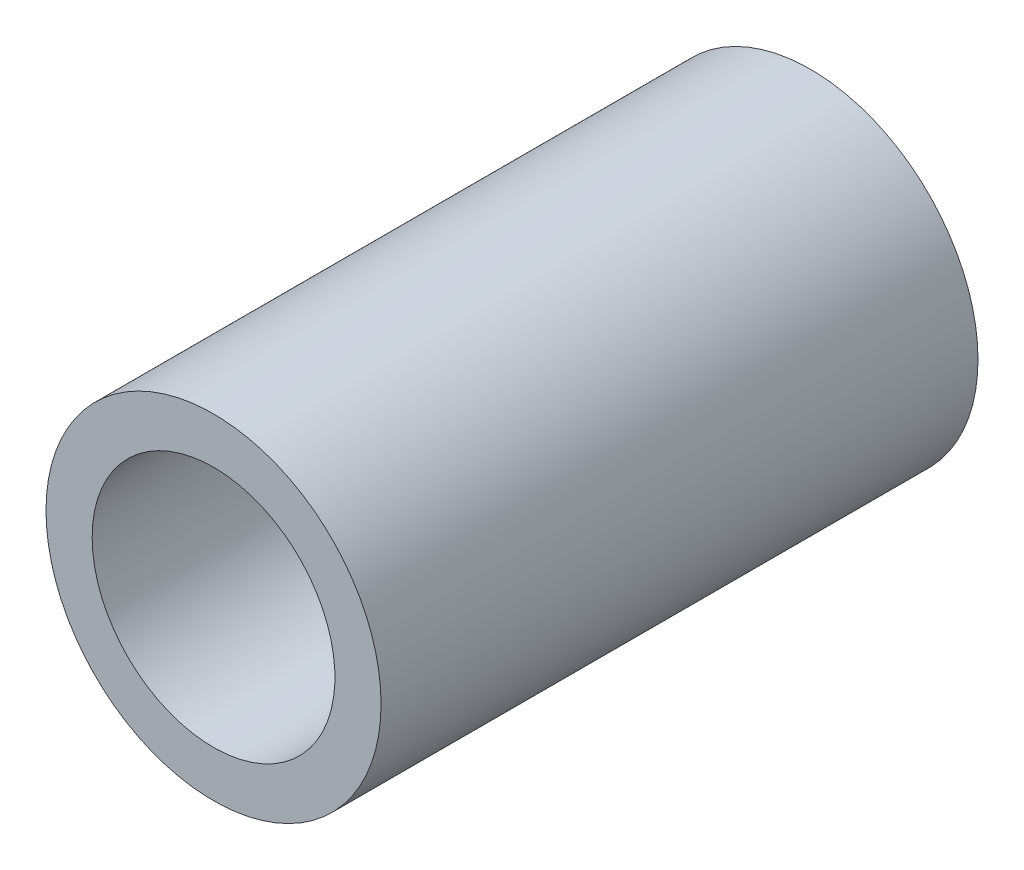
ISO-10303-21;
HEADER;
FILE_DESCRIPTION(('STEP AP214'),'2;1');
FILE_NAME('part.step','',(''),(''),'','','');
FILE_SCHEMA(('AUTOMOTIVE_DESIGN { 1 0 10303 214 1 1 1 1 }'));
ENDSEC;
DATA;
#1=APPLICATION_CONTEXT('core data for automotive mechanical design processes');
#2=APPLICATION_PROTOCOL_DEFINITION('international standard','automotive_design',2000,#1);
#3=PRODUCT_CONTEXT('',#1,'mechanical');
#4=PRODUCT('Part','Part','',(#3));
#5=PRODUCT_RELATED_PRODUCT_CATEGORY('part','',(#4));
#6=PRODUCT_DEFINITION_FORMATION('','',#4);
#7=PRODUCT_DEFINITION_CONTEXT('part definition',#1,'design');
#8=PRODUCT_DEFINITION('design','',#6,#7);
#9=PRODUCT_DEFINITION_SHAPE('','',#8);
#10=(LENGTH_UNIT() NAMED_UNIT(*) SI_UNIT(.MILLI.,.METRE.));
#11=(NAMED_UNIT(*) PLANE_ANGLE_UNIT() SI_UNIT($,.RADIAN.));
#12=(NAMED_UNIT(*) SI_UNIT($,.STERADIAN.) SOLID_ANGLE_UNIT());
#13=UNCERTAINTY_MEASURE_WITH_UNIT(LENGTH_MEASURE(1.E-05),#10,'distance_accuracy_value','');
#14=(GEOMETRIC_REPRESENTATION_CONTEXT(3) GLOBAL_UNCERTAINTY_ASSIGNED_CONTEXT((#13)) GLOBAL_UNIT_ASSIGNED_CONTEXT((#10,
#11,#12)) REPRESENTATION_CONTEXT('',''));
#15=CARTESIAN_POINT('',(0.,0.,0.));
#16=DIRECTION('',(0.,0.,1.));
#17=DIRECTION('',(1.,0.,0.));
#18=AXIS2_PLACEMENT_3D('',#15,#16,#17);
#19=CARTESIAN_POINT('',(0.,0.,38.1));
#20=DIRECTION('',(0.,0.,1.));
#21=DIRECTION('',(1.,0.,0.));
#22=AXIS2_PLACEMENT_3D('',#19,#20,#21);
#23=PLANE('',#22);
#24=CARTESIAN_POINT('',(0.,0.,38.1));
#25=DIRECTION('',(0.,0.,1.));
#26=DIRECTION('',(1.,0.,0.));
#27=AXIS2_PLACEMENT_3D('',#24,#25,#26);
#28=CIRCLE('',#27,10.6934);
#29=CARTESIAN_POINT('',(-10.6934,0.,38.1));
#30=VERTEX_POINT('',#29);
#31=EDGE_CURVE('E10',#30,#30,#28,.T.);
#32=ORIENTED_EDGE('',*,*,#31,.T.);
#33=EDGE_LOOP('',(#32));
#34=FACE_BOUND('',#33,.T.);
#35=CARTESIAN_POINT('',(0.,0.,38.1));
#36=DIRECTION('',(0.,0.,1.));
#37=DIRECTION('',(1.,0.,0.));
#38=AXIS2_PLACEMENT_3D('',#35,#36,#37);
#39=CIRCLE('',#38,7.747);
#40=CARTESIAN_POINT('',(-7.747,0.,38.1));
#41=VERTEX_POINT('',#40);
#42=EDGE_CURVE('E46',#41,#41,#39,.T.);
#43=ORIENTED_EDGE('',*,*,#42,.F.);
#44=EDGE_LOOP('',(#43));
#45=FACE_BOUND('',#44,.T.);
#46=ADVANCED_FACE('F35',(#34,#45),#23,.T.);
#47=CARTESIAN_POINT('',(0.,0.,0.));
#48=DIRECTION('',(0.,0.,1.));
#49=DIRECTION('',(1.,0.,0.));
#50=AXIS2_PLACEMENT_3D('',#47,#48,#49);
#51=PLANE('',#50);
#52=CARTESIAN_POINT('',(0.,0.,0.));
#53=DIRECTION('',(0.,0.,1.));
#54=DIRECTION('',(1.,0.,0.));
#55=AXIS2_PLACEMENT_3D('',#52,#53,#54);
#56=CIRCLE('',#55,10.6934);
#57=CARTESIAN_POINT('',(-10.6934,0.,0.));
#58=VERTEX_POINT('',#57);
#59=EDGE_CURVE('E39',#58,#58,#56,.T.);
#60=ORIENTED_EDGE('',*,*,#59,.F.);
#61=EDGE_LOOP('',(#60));
#62=FACE_BOUND('',#61,.T.);
#63=CARTESIAN_POINT('',(0.,0.,0.));
#64=DIRECTION('',(0.,0.,1.));
#65=DIRECTION('',(1.,0.,0.));
#66=AXIS2_PLACEMENT_3D('',#63,#64,#65);
#67=CIRCLE('',#66,7.747);
#68=CARTESIAN_POINT('',(-7.747,0.,0.));
#69=VERTEX_POINT('',#68);
#70=EDGE_CURVE('E48',#69,#69,#67,.T.);
#71=ORIENTED_EDGE('',*,*,#70,.T.);
#72=EDGE_LOOP('',(#71));
#73=FACE_BOUND('',#72,.T.);
#74=ADVANCED_FACE('F58',(#62,#73),#51,.F.);
#75=CARTESIAN_POINT('',(0.,0.,38.1));
#76=DIRECTION('',(0.,0.,-1.));
#77=DIRECTION('',(-1.,0.,0.));
#78=AXIS2_PLACEMENT_3D('',#75,#76,#77);
#79=CYLINDRICAL_SURFACE('',#78,10.6934);
#80=CARTESIAN_POINT('',(-10.6934,0.,38.1));
#81=CARTESIAN_POINT('',(-10.6934,0.,37.703125));
#82=CARTESIAN_POINT('',(-10.6934,0.,37.30625));
#83=CARTESIAN_POINT('',(-10.6934,0.,36.5125));
#84=CARTESIAN_POINT('',(-10.6934,0.,36.115625));
#85=CARTESIAN_POINT('',(-10.6934,0.,35.321875));
#86=CARTESIAN_POINT('',(-10.6934,0.,34.925));
#87=CARTESIAN_POINT('',(-10.6934,0.,34.13125));
#88=CARTESIAN_POINT('',(-10.6934,0.,33.734375));
#89=CARTESIAN_POINT('',(-10.6934,0.,32.940625));
#90=CARTESIAN_POINT('',(-10.6934,0.,32.54375));
#91=CARTESIAN_POINT('',(-10.6934,0.,31.75));
#92=CARTESIAN_POINT('',(-10.6934,0.,31.353125));
#93=CARTESIAN_POINT('',(-10.6934,0.,30.559375));
#94=CARTESIAN_POINT('',(-10.6934,0.,30.1625));
#95=CARTESIAN_POINT('',(-10.6934,0.,29.36875));
#96=CARTESIAN_POINT('',(-10.6934,0.,28.971875));
#97=CARTESIAN_POINT('',(-10.6934,0.,28.178125));
#98=CARTESIAN_POINT('',(-10.6934,0.,27.78125));
#99=CARTESIAN_POINT('',(-10.6934,0.,26.9875));
#100=CARTESIAN_POINT('',(-10.6934,0.,26.590625));
#101=CARTESIAN_POINT('',(-10.6934,0.,25.796875));
#102=CARTESIAN_POINT('',(-10.6934,0.,25.4));
#103=CARTESIAN_POINT('',(-10.6934,0.,24.60625));
#104=CARTESIAN_POINT('',(-10.6934,0.,24.209375));
#105=CARTESIAN_POINT('',(-10.6934,0.,23.415625));
#106=CARTESIAN_POINT('',(-10.6934,0.,23.01875));
#107=CARTESIAN_POINT('',(-10.6934,0.,22.225));
#108=CARTESIAN_POINT('',(-10.6934,0.,21.828125));
#109=CARTESIAN_POINT('',(-10.6934,0.,21.034375));
#110=CARTESIAN_POINT('',(-10.6934,0.,20.6375));
#111=CARTESIAN_POINT('',(-10.6934,0.,19.84375));
#112=CARTESIAN_POINT('',(-10.6934,0.,19.446875));
#113=CARTESIAN_POINT('',(-10.6934,0.,18.653125));
#114=CARTESIAN_POINT('',(-10.6934,0.,18.25625));
#115=CARTESIAN_POINT('',(-10.6934,0.,17.4625));
#116=CARTESIAN_POINT('',(-10.6934,0.,17.065625));
#117=CARTESIAN_POINT('',(-10.6934,0.,16.271875));
#118=CARTESIAN_POINT('',(-10.6934,0.,15.875));
#119=CARTESIAN_POINT('',(-10.6934,0.,15.08125));
#120=CARTESIAN_POINT('',(-10.6934,0.,14.684375));
#121=CARTESIAN_POINT('',(-10.6934,0.,13.890625));
#122=CARTESIAN_POINT('',(-10.6934,0.,13.49375));
#123=CARTESIAN_POINT('',(-10.6934,0.,12.7));
#124=CARTESIAN_POINT('',(-10.6934,0.,12.303125));
#125=CARTESIAN_POINT('',(-10.6934,0.,11.509375));
#126=CARTESIAN_POINT('',(-10.6934,0.,11.1125));
#127=CARTESIAN_POINT('',(-10.6934,0.,10.31875));
#128=CARTESIAN_POINT('',(-10.6934,0.,9.92187499999999));
#129=CARTESIAN_POINT('',(-10.6934,0.,9.128125));
#130=CARTESIAN_POINT('',(-10.6934,0.,8.73124999999999));
#131=CARTESIAN_POINT('',(-10.6934,0.,7.93749999999999));
#132=CARTESIAN_POINT('',(-10.6934,0.,7.54062499999999));
#133=CARTESIAN_POINT('',(-10.6934,0.,6.746875));
#134=CARTESIAN_POINT('',(-10.6934,0.,6.35));
#135=CARTESIAN_POINT('',(-10.6934,0.,5.55625));
#136=CARTESIAN_POINT('',(-10.6934,0.,5.159375));
#137=CARTESIAN_POINT('',(-10.6934,0.,4.365625));
#138=CARTESIAN_POINT('',(-10.6934,0.,3.96875));
#139=CARTESIAN_POINT('',(-10.6934,0.,3.175));
#140=CARTESIAN_POINT('',(-10.6934,0.,2.778125));
#141=CARTESIAN_POINT('',(-10.6934,0.,1.984375));
#142=CARTESIAN_POINT('',(-10.6934,0.,1.5875));
#143=CARTESIAN_POINT('',(-10.6934,0.,0.79375));
#144=CARTESIAN_POINT('',(-10.6934,0.,0.396875));
#145=CARTESIAN_POINT('',(-10.6934,0.,0.));
#146=B_SPLINE_CURVE_WITH_KNOTS('',3,(#80,#81,#82,#83,#84,#85,#86,#87,#88,#89,#90,#91,#92,#93,
#94,#95,#96,#97,#98,#99,#100,#101,#102,#103,#104,#105,#106,#107,#108,#109,#110,#111,#112,#113,
#114,#115,#116,#117,#118,#119,#120,#121,#122,#123,#124,#125,#126,#127,#128,#129,#130,#131,#132,
#133,#134,#135,#136,#137,#138,#139,#140,#141,#142,#143,#144,#145),.UNSPECIFIED.,.F.,.F.,(4,2,2,
2,2,2,2,2,2,2,2,2,2,2,2,2,2,2,2,2,2,2,2,2,2,2,2,2,2,2,2,2,4),(0.,1.190625,2.38125,3.571875,
4.7625,5.953125,7.14375,8.334375,9.52500000000001,10.715625,11.90625,13.096875,14.2875,
15.478125,16.66875,17.859375,19.05,20.240625,21.43125,22.621875,23.8125,25.003125,26.19375,
27.384375,28.575,29.765625,30.95625,32.146875,33.3375,34.528125,35.71875,36.909375,38.1),.UNSPECIFIED.);
#147=EDGE_CURVE('BSEAM37',#30,#58,#146,.T.);
#148=ORIENTED_EDGE('',*,*,#31,.F.);
#149=ORIENTED_EDGE('',*,*,#59,.T.);
#150=ORIENTED_EDGE('',*,*,#147,.T.);
#151=ORIENTED_EDGE('',*,*,#147,.F.);
#152=EDGE_LOOP('',(#148,#150,#149,#151));
#153=FACE_BOUND('',#152,.T.);
#154=ADVANCED_FACE('F37',(#153),#79,.T.);
#155=CARTESIAN_POINT('',(0.,0.,38.1));
#156=DIRECTION('',(0.,0.,-1.));
#157=DIRECTION('',(-1.,0.,0.));
#158=AXIS2_PLACEMENT_3D('',#155,#156,#157);
#159=CYLINDRICAL_SURFACE('',#158,7.747);
#160=CARTESIAN_POINT('',(-7.747,0.,38.1));
#161=CARTESIAN_POINT('',(-7.747,0.,37.703125));
#162=CARTESIAN_POINT('',(-7.747,0.,37.30625));
#163=CARTESIAN_POINT('',(-7.747,0.,36.5125));
#164=CARTESIAN_POINT('',(-7.747,0.,36.115625));
#165=CARTESIAN_POINT('',(-7.747,0.,35.321875));
#166=CARTESIAN_POINT('',(-7.747,0.,34.925));
#167=CARTESIAN_POINT('',(-7.747,0.,34.13125));
#168=CARTESIAN_POINT('',(-7.747,0.,33.734375));
#169=CARTESIAN_POINT('',(-7.747,0.,32.940625));
#170=CARTESIAN_POINT('',(-7.747,0.,32.54375));
#171=CARTESIAN_POINT('',(-7.747,0.,31.75));
#172=CARTESIAN_POINT('',(-7.747,0.,31.353125));
#173=CARTESIAN_POINT('',(-7.747,0.,30.559375));
#174=CARTESIAN_POINT('',(-7.747,0.,30.1625));
#175=CARTESIAN_POINT('',(-7.747,0.,29.36875));
#176=CARTESIAN_POINT('',(-7.747,0.,28.971875));
#177=CARTESIAN_POINT('',(-7.747,0.,28.178125));
#178=CARTESIAN_POINT('',(-7.747,0.,27.78125));
#179=CARTESIAN_POINT('',(-7.747,0.,26.9875));
#180=CARTESIAN_POINT('',(-7.747,0.,26.590625));
#181=CARTESIAN_POINT('',(-7.747,0.,25.796875));
#182=CARTESIAN_POINT('',(-7.747,0.,25.4));
#183=CARTESIAN_POINT('',(-7.747,0.,24.60625));
#184=CARTESIAN_POINT('',(-7.747,0.,24.209375));
#185=CARTESIAN_POINT('',(-7.747,0.,23.415625));
#186=CARTESIAN_POINT('',(-7.747,0.,23.01875));
#187=CARTESIAN_POINT('',(-7.747,0.,22.225));
#188=CARTESIAN_POINT('',(-7.747,0.,21.828125));
#189=CARTESIAN_POINT('',(-7.747,0.,21.034375));
#190=CARTESIAN_POINT('',(-7.747,0.,20.6375));
#191=CARTESIAN_POINT('',(-7.747,0.,19.84375));
#192=CARTESIAN_POINT('',(-7.747,0.,19.446875));
#193=CARTESIAN_POINT('',(-7.747,0.,18.653125));
#194=CARTESIAN_POINT('',(-7.747,0.,18.25625));
#195=CARTESIAN_POINT('',(-7.747,0.,17.4625));
#196=CARTESIAN_POINT('',(-7.747,0.,17.065625));
#197=CARTESIAN_POINT('',(-7.747,0.,16.271875));
#198=CARTESIAN_POINT('',(-7.747,0.,15.875));
#199=CARTESIAN_POINT('',(-7.747,0.,15.08125));
#200=CARTESIAN_POINT('',(-7.747,0.,14.684375));
#201=CARTESIAN_POINT('',(-7.747,0.,13.890625));
#202=CARTESIAN_POINT('',(-7.747,0.,13.49375));
#203=CARTESIAN_POINT('',(-7.747,0.,12.7));
#204=CARTESIAN_POINT('',(-7.747,0.,12.303125));
#205=CARTESIAN_POINT('',(-7.747,0.,11.509375));
#206=CARTESIAN_POINT('',(-7.747,0.,11.1125));
#207=CARTESIAN_POINT('',(-7.747,0.,10.31875));
#208=CARTESIAN_POINT('',(-7.747,0.,9.92187499999999));
#209=CARTESIAN_POINT('',(-7.747,0.,9.128125));
#210=CARTESIAN_POINT('',(-7.747,0.,8.73124999999999));
#211=CARTESIAN_POINT('',(-7.747,0.,7.93749999999999));
#212=CARTESIAN_POINT('',(-7.747,0.,7.54062499999999));
#213=CARTESIAN_POINT('',(-7.747,0.,6.746875));
#214=CARTESIAN_POINT('',(-7.747,0.,6.35));
#215=CARTESIAN_POINT('',(-7.747,0.,5.55625));
#216=CARTESIAN_POINT('',(-7.747,0.,5.159375));
#217=CARTESIAN_POINT('',(-7.747,0.,4.365625));
#218=CARTESIAN_POINT('',(-7.747,0.,3.96875));
#219=CARTESIAN_POINT('',(-7.747,0.,3.175));
#220=CARTESIAN_POINT('',(-7.747,0.,2.778125));
#221=CARTESIAN_POINT('',(-7.747,0.,1.984375));
#222=CARTESIAN_POINT('',(-7.747,0.,1.5875));
#223=CARTESIAN_POINT('',(-7.747,0.,0.79375));
#224=CARTESIAN_POINT('',(-7.747,0.,0.396875));
#225=CARTESIAN_POINT('',(-7.747,0.,0.));
#226=B_SPLINE_CURVE_WITH_KNOTS('',3,(#160,#161,#162,#163,#164,#165,#166,#167,#168,#169,#170,
#171,#172,#173,#174,#175,#176,#177,#178,#179,#180,#181,#182,#183,#184,#185,#186,#187,#188,#189,
#190,#191,#192,#193,#194,#195,#196,#197,#198,#199,#200,#201,#202,#203,#204,#205,#206,#207,#208,
#209,#210,#211,#212,#213,#214,#215,#216,#217,#218,#219,#220,#221,#222,#223,#224,#225),
.UNSPECIFIED.,.F.,.F.,(4,2,2,2,2,2,2,2,2,2,2,2,2,2,2,2,2,2,2,2,2,2,2,2,2,2,2,2,2,2,2,2,4),(0.,
1.190625,2.38125,3.571875,4.7625,5.953125,7.14375,8.334375,9.52500000000001,10.715625,11.90625,
13.096875,14.2875,15.478125,16.66875,17.859375,19.05,20.240625,21.43125,22.621875,23.8125,
25.003125,26.19375,27.384375,28.575,29.765625,30.95625,32.146875,33.3375,34.528125,35.71875,
36.909375,38.1),.UNSPECIFIED.);
#227=EDGE_CURVE('BSEAM54',#41,#69,#226,.T.);
#228=ORIENTED_EDGE('',*,*,#42,.T.);
#229=ORIENTED_EDGE('',*,*,#70,.F.);
#230=ORIENTED_EDGE('',*,*,#227,.T.);
#231=ORIENTED_EDGE('',*,*,#227,.F.);
#232=EDGE_LOOP('',(#228,#230,#229,#231));
#233=FACE_BOUND('',#232,.T.);
#234=ADVANCED_FACE('F54',(#233),#159,.F.);
#235=CLOSED_SHELL('',(#46,#74,#154,#234));
#236=MANIFOLD_SOLID_BREP('B2',#235);
#237=ADVANCED_BREP_SHAPE_REPRESENTATION('',(#18,#236),#14);
#238=SHAPE_DEFINITION_REPRESENTATION(#9,#237);
ENDSEC;
END-ISO-10303-21;
